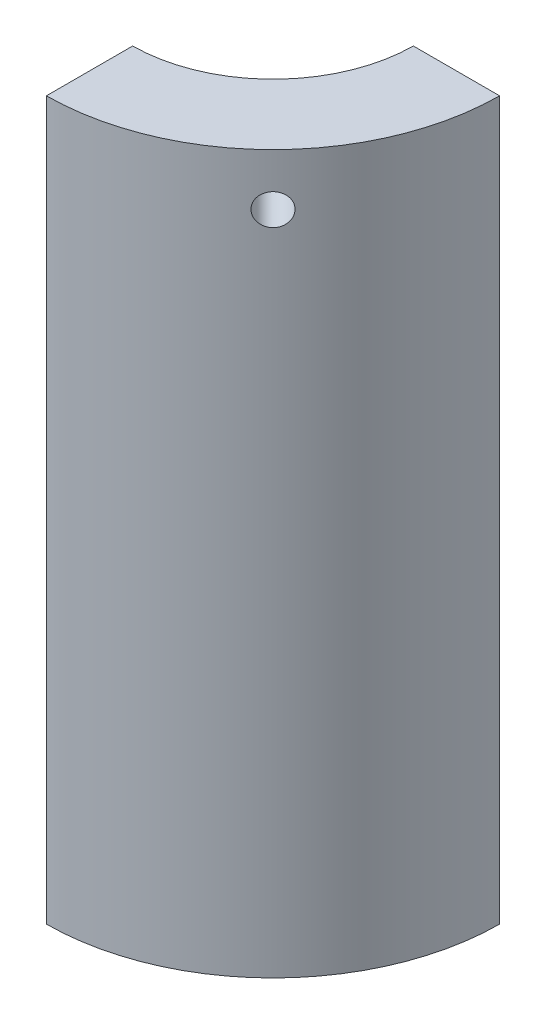
ISO-10303-21;
HEADER;
FILE_DESCRIPTION(('STEP AP214'),'2;1');
FILE_NAME('part.step','',(''),(''),'','','');
FILE_SCHEMA(('AUTOMOTIVE_DESIGN { 1 0 10303 214 1 1 1 1 }'));
ENDSEC;
DATA;
#1=APPLICATION_CONTEXT('core data for automotive mechanical design processes');
#2=APPLICATION_PROTOCOL_DEFINITION('international standard','automotive_design',2000,#1);
#3=PRODUCT_CONTEXT('',#1,'mechanical');
#4=PRODUCT('Part','Part','',(#3));
#5=PRODUCT_RELATED_PRODUCT_CATEGORY('part','',(#4));
#6=PRODUCT_DEFINITION_FORMATION('','',#4);
#7=PRODUCT_DEFINITION_CONTEXT('part definition',#1,'design');
#8=PRODUCT_DEFINITION('design','',#6,#7);
#9=PRODUCT_DEFINITION_SHAPE('','',#8);
#10=(LENGTH_UNIT() NAMED_UNIT(*) SI_UNIT(.MILLI.,.METRE.));
#11=(NAMED_UNIT(*) PLANE_ANGLE_UNIT() SI_UNIT($,.RADIAN.));
#12=(NAMED_UNIT(*) SI_UNIT($,.STERADIAN.) SOLID_ANGLE_UNIT());
#13=UNCERTAINTY_MEASURE_WITH_UNIT(LENGTH_MEASURE(1.E-05),#10,'distance_accuracy_value','');
#14=(GEOMETRIC_REPRESENTATION_CONTEXT(3) GLOBAL_UNCERTAINTY_ASSIGNED_CONTEXT((#13)) GLOBAL_UNIT_ASSIGNED_CONTEXT((#10,
#11,#12)) REPRESENTATION_CONTEXT('',''));
#15=CARTESIAN_POINT('',(0.,0.,0.));
#16=DIRECTION('',(0.,0.,1.));
#17=DIRECTION('',(1.,0.,0.));
#18=AXIS2_PLACEMENT_3D('',#15,#16,#17);
#19=CARTESIAN_POINT('',(-0.0819550041281925,-54.649002659367,-2.91275683956761));
#20=DIRECTION('',(0.,1.,0.));
#21=DIRECTION('',(0.,0.,1.));
#22=AXIS2_PLACEMENT_3D('',#19,#20,#21);
#23=CYLINDRICAL_SURFACE('',#22,13.6);
#24=CARTESIAN_POINT('',(10.5366861259922,9.35099734063299,5.58456394699311));
#25=CARTESIAN_POINT('',(10.5366843333004,9.43497761274647,5.58456726459027));
#26=CARTESIAN_POINT('',(10.5322416975841,9.51901224443722,5.5901271395209));
#27=CARTESIAN_POINT('',(10.5145412136004,9.68474823178205,5.61217483485136));
#28=CARTESIAN_POINT('',(10.5012738443178,9.76644696783289,5.6286744580967));
#29=CARTESIAN_POINT('',(10.4661794258843,9.92508726089925,5.67197564802975));
#30=CARTESIAN_POINT('',(10.4443578045023,10.002031798739,5.69877068195031));
#31=CARTESIAN_POINT('',(10.392576064214,10.1490433813716,5.76167978497555));
#32=CARTESIAN_POINT('',(10.3626174746914,10.2191117152156,5.79779210278655));
#33=CARTESIAN_POINT('',(10.2950123912164,10.3507052808136,5.87822207274482));
#34=CARTESIAN_POINT('',(10.2573362788045,10.4121960173808,5.92257127347902));
#35=CARTESIAN_POINT('',(10.1751412687481,10.5245914721989,6.01786055152042));
#36=CARTESIAN_POINT('',(10.1306220478704,10.57549569013,6.06880094014334));
#37=CARTESIAN_POINT('',(10.0355924836175,10.6653943476593,6.17571681931278));
#38=CARTESIAN_POINT('',(9.98506708938574,10.7043579533337,6.23170487030442));
#39=CARTESIAN_POINT('',(9.87931419716593,10.7690720126269,6.34679046523331));
#40=CARTESIAN_POINT('',(9.82408683683894,10.7948228529253,6.4058879181162));
#41=CARTESIAN_POINT('',(9.71057569617251,10.832278402526,6.52509700930848));
#42=CARTESIAN_POINT('',(9.65230533084169,10.844040091887,6.58520351510839));
#43=CARTESIAN_POINT('',(9.53409184404345,10.8533598847648,6.70486838188246));
#44=CARTESIAN_POINT('',(9.47414877466008,10.8509184300438,6.7644267598474));
#45=CARTESIAN_POINT('',(9.35458477909854,10.8319472637327,6.88105056391333));
#46=CARTESIAN_POINT('',(9.29496358507526,10.8154788259334,6.9381256994772));
#47=CARTESIAN_POINT('',(9.17757181317318,10.7690167546947,7.04855137888179));
#48=CARTESIAN_POINT('',(9.11980126374145,10.739022913457,7.10190186548411));
#49=CARTESIAN_POINT('',(9.00779257958304,10.6662950483306,7.20367699654527));
#50=CARTESIAN_POINT('',(8.95356219602528,10.6235341406904,7.25209095461346));
#51=CARTESIAN_POINT('',(8.85051723484523,10.5265055002948,7.34276156078564));
#52=CARTESIAN_POINT('',(8.80170285072048,10.4722373566218,7.38501798891631));
#53=CARTESIAN_POINT('',(8.71087537853335,10.3533906530275,7.46268200994373));
#54=CARTESIAN_POINT('',(8.66889987461099,10.2887587514455,7.49805195145781));
#55=CARTESIAN_POINT('',(8.5935291924902,10.1512034761403,7.56094313636126));
#56=CARTESIAN_POINT('',(8.56013403159186,10.0782800857,7.5884643639257));
#57=CARTESIAN_POINT('',(8.50312032388389,9.92616847012183,7.63512664072593));
#58=CARTESIAN_POINT('',(8.47950456496442,9.84697846616462,7.65426530036746));
#59=CARTESIAN_POINT('',(8.44294512554007,9.6846034389268,7.68378197455839));
#60=CARTESIAN_POINT('',(8.43000104766154,9.60141856452236,7.69416031530977));
#61=CARTESIAN_POINT('',(8.4153164908242,9.4338832280635,7.70592795811207));
#62=CARTESIAN_POINT('',(8.41351747977591,9.34954119102084,7.70736422270005));
#63=CARTESIAN_POINT('',(8.42103545825922,9.18167502130145,7.7013458296166));
#64=CARTESIAN_POINT('',(8.43035226438185,9.0981508751526,7.69389131864137));
#65=CARTESIAN_POINT('',(8.45970941438736,8.93451121403336,7.67026346877571));
#66=CARTESIAN_POINT('',(8.47972199048178,8.85438744997251,7.6541127058247));
#67=CARTESIAN_POINT('',(8.52971196218131,8.69956592431732,7.61341173686136));
#68=CARTESIAN_POINT('',(8.55968963354938,8.62486831295,7.58886129840519));
#69=CARTESIAN_POINT('',(8.62867525711629,8.48268043841175,7.531711907697));
#70=CARTESIAN_POINT('',(8.66772000483644,8.41522122620018,7.49908012330725));
#71=CARTESIAN_POINT('',(8.75340516338569,8.28974069515303,7.42646732334823));
#72=CARTESIAN_POINT('',(8.80004580334611,8.23171966112721,7.38648608607684));
#73=CARTESIAN_POINT('',(8.8995651689871,8.12650339694943,7.29981678492099));
#74=CARTESIAN_POINT('',(8.95247046165562,8.07935696714672,7.25309996063789));
#75=CARTESIAN_POINT('',(9.06260459794293,7.99756474628884,7.15414449907944));
#76=CARTESIAN_POINT('',(9.11983337131075,7.96291875217057,7.10190595151946));
#77=CARTESIAN_POINT('',(9.23665651831976,7.90719275689125,6.99329289863657));
#78=CARTESIAN_POINT('',(9.29624554604115,7.88608377294136,6.93692751931356));
#79=CARTESIAN_POINT('',(9.41606668452292,7.85793652569409,6.82143569023883));
#80=CARTESIAN_POINT('',(9.4762987729423,7.85089777516234,6.76230933616875));
#81=CARTESIAN_POINT('',(9.59531143744827,7.85109851001999,6.64326541228344));
#82=CARTESIAN_POINT('',(9.65409801926288,7.85826243752462,6.58335370485446));
#83=CARTESIAN_POINT('',(9.76892491519434,7.8865061180053,6.46418371799018));
#84=CARTESIAN_POINT('',(9.82496522854554,7.90758587486098,6.40492543873706));
#85=CARTESIAN_POINT('',(9.93284028003523,7.96304079234487,6.28888189733161));
#86=CARTESIAN_POINT('',(9.98467589055518,7.99741318646971,6.23209612332834));
#87=CARTESIAN_POINT('',(10.0829144178174,8.07846977512315,6.1227750928411));
#88=CARTESIAN_POINT('',(10.1293173287495,8.12515398281908,6.07023984090308));
#89=CARTESIAN_POINT('',(10.2158833303454,8.22979113387684,5.97087402479052));
#90=CARTESIAN_POINT('',(10.2560133636976,8.28780037740364,5.92407394633321));
#91=CARTESIAN_POINT('',(10.3289146730831,8.41332676999537,5.83807054114567));
#92=CARTESIAN_POINT('',(10.3616841907216,8.48084618474334,5.7988690299856));
#93=CARTESIAN_POINT('',(10.4192863047688,8.62370590974001,5.72934832322836));
#94=CARTESIAN_POINT('',(10.4440944890375,8.69906935426971,5.69905647091983));
#95=CARTESIAN_POINT('',(10.4851340319773,8.85526602136046,5.64865048620078));
#96=CARTESIAN_POINT('',(10.5013749325306,8.93609304509777,5.62852503194543));
#97=CARTESIAN_POINT('',(10.521001482927,9.07296884982259,5.6041357931914));
#98=CARTESIAN_POINT('',(10.5268775268496,9.12814676816543,5.59680908100987));
#99=CARTESIAN_POINT('',(10.53472043453,9.23920754345745,5.58702206677314));
#100=CARTESIAN_POINT('',(10.5366873194143,9.29509039659527,5.58456173841824));
#101=CARTESIAN_POINT('',(10.5366861259922,9.35099734063299,5.58456394699311));
#102=B_SPLINE_CURVE_WITH_KNOTS('',3,(#24,#25,#26,#27,#28,#29,#30,#31,#32,#33,#34,#35,#36,#37,
#38,#39,#40,#41,#42,#43,#44,#45,#46,#47,#48,#49,#50,#51,#52,#53,#54,#55,#56,#57,#58,#59,#60,#61,
#62,#63,#64,#65,#66,#67,#68,#69,#70,#71,#72,#73,#74,#75,#76,#77,#78,#79,#80,#81,#82,#83,#84,#85,
#86,#87,#88,#89,#90,#91,#92,#93,#94,#95,#96,#97,#98,#99,#100,#101),.UNSPECIFIED.,.T.,.F.,(4,2,2,
2,2,2,2,2,2,2,2,2,2,2,2,2,2,2,2,2,2,2,2,2,2,2,2,2,2,2,2,2,2,2,2,2,2,2,4),(0.,0.251736626328112,
0.503745293088847,0.755594315671462,1.00739603469475,1.26018286473901,1.51298163880034,
1.76642781214165,2.01986656780302,2.27226945236711,2.524664486451,2.77596260969474,
3.0272645939024,3.27909952497933,3.53094345047314,3.78412786268911,4.03731278538314,
4.29056983586601,4.54381745557365,4.79573392431704,5.04764623654199,5.2989077018795,
5.55017612092609,5.80248261578413,6.05479672291884,6.30822198084159,6.56164312181668,
6.81451985960879,7.06738784044762,7.31891417977464,7.57044058922551,7.82191467839664,
8.07338903651711,8.32614693606856,8.57896515429947,8.83255135127875,9.08585451504535,
9.25344032046004,9.42102522017737),.UNSPECIFIED.);
#103=CARTESIAN_POINT('',(10.5366861259922,9.35099734063299,5.58456394699311));
#104=VERTEX_POINT('',#103);
#105=EDGE_CURVE('E111',#104,#104,#102,.T.);
#106=ORIENTED_EDGE('',*,*,#105,.T.);
#107=EDGE_LOOP('',(#106));
#108=FACE_BOUND('',#107,.T.);
#109=CARTESIAN_POINT('',(-0.0819550041281925,14.350997340633,-2.91275683956761));
#110=DIRECTION('',(0.,1.,0.));
#111=DIRECTION('',(0.,0.,-1.));
#112=AXIS2_PLACEMENT_3D('',#109,#110,#111);
#113=CIRCLE('',#112,13.6);
#114=CARTESIAN_POINT('',(0.0180449958718076,14.350997340633,10.6868755084042));
#115=VERTEX_POINT('',#114);
#116=CARTESIAN_POINT('',(13.5176773438436,14.350997340633,-2.81275683956761));
#117=VERTEX_POINT('',#116);
#118=EDGE_CURVE('E108',#115,#117,#113,.T.);
#119=ORIENTED_EDGE('',*,*,#118,.T.);
#120=DIRECTION('',(0.,1.,0.));
#121=VECTOR('',#120,1.);
#122=CARTESIAN_POINT('',(13.5176773438436,-54.649002659367,-2.81275683956761));
#123=LINE('',#122,#121);
#124=CARTESIAN_POINT('',(13.5176773438436,-54.649002659367,-2.81275683956761));
#125=VERTEX_POINT('',#124);
#126=EDGE_CURVE('E11',#125,#117,#123,.T.);
#127=ORIENTED_EDGE('',*,*,#126,.F.);
#128=CARTESIAN_POINT('',(-0.0819550041281925,-54.649002659367,-2.91275683956761));
#129=DIRECTION('',(0.,1.,0.));
#130=DIRECTION('',(0.,0.,-1.));
#131=AXIS2_PLACEMENT_3D('',#128,#129,#130);
#132=CIRCLE('',#131,13.6);
#133=CARTESIAN_POINT('',(0.0180449958718076,-54.649002659367,10.6868755084042));
#134=VERTEX_POINT('',#133);
#135=EDGE_CURVE('E95',#134,#125,#132,.T.);
#136=ORIENTED_EDGE('',*,*,#135,.F.);
#137=DIRECTION('',(0.,1.,0.));
#138=VECTOR('',#137,1.);
#139=CARTESIAN_POINT('',(0.0180449958718076,-54.649002659367,10.6868755084042));
#140=LINE('',#139,#138);
#141=EDGE_CURVE('E104',#134,#115,#140,.T.);
#142=ORIENTED_EDGE('',*,*,#141,.T.);
#143=EDGE_LOOP('',(#119,#127,#136,#142));
#144=FACE_BOUND('',#143,.T.);
#145=ADVANCED_FACE('F37',(#108,#144),#23,.F.);
#146=CARTESIAN_POINT('',(13.5176773438436,-54.649002659367,-2.81275683956761));
#147=DIRECTION('',(0.,0.,1.));
#148=DIRECTION('',(1.,0.,0.));
#149=AXIS2_PLACEMENT_3D('',#146,#147,#148);
#150=PLANE('',#149);
#151=DIRECTION('',(1.,0.,0.));
#152=VECTOR('',#151,1.);
#153=CARTESIAN_POINT('',(13.5176773438436,14.350997340633,-2.81275683956761));
#154=LINE('',#153,#152);
#155=CARTESIAN_POINT('',(21.8138166424706,14.350997340633,-2.81275683956761));
#156=VERTEX_POINT('',#155);
#157=EDGE_CURVE('E99',#117,#156,#154,.T.);
#158=ORIENTED_EDGE('',*,*,#157,.T.);
#159=DIRECTION('',(0.,1.,0.));
#160=VECTOR('',#159,1.);
#161=CARTESIAN_POINT('',(21.8138166424706,-54.649002659367,-2.81275683956761));
#162=LINE('',#161,#160);
#163=CARTESIAN_POINT('',(21.8138166424706,-54.649002659367,-2.81275683956761));
#164=VERTEX_POINT('',#163);
#165=EDGE_CURVE('E52',#164,#156,#162,.T.);
#166=ORIENTED_EDGE('',*,*,#165,.F.);
#167=DIRECTION('',(1.,0.,0.));
#168=VECTOR('',#167,1.);
#169=CARTESIAN_POINT('',(13.5176773438436,-54.649002659367,-2.81275683956761));
#170=LINE('',#169,#168);
#171=EDGE_CURVE('E90',#125,#164,#170,.T.);
#172=ORIENTED_EDGE('',*,*,#171,.F.);
#173=ORIENTED_EDGE('',*,*,#126,.T.);
#174=EDGE_LOOP('',(#158,#166,#172,#173));
#175=FACE_BOUND('',#174,.T.);
#176=ADVANCED_FACE('F98',(#175),#150,.F.);
#177=CARTESIAN_POINT('',(-0.0819550041281925,-54.649002659367,-2.91275683956761));
#178=DIRECTION('',(0.,1.,0.));
#179=DIRECTION('',(0.,0.,1.));
#180=AXIS2_PLACEMENT_3D('',#177,#178,#179);
#181=CYLINDRICAL_SURFACE('',#180,21.896);
#182=CARTESIAN_POINT('',(16.4251419088551,9.35099734063299,11.473019729856));
#183=CARTESIAN_POINT('',(16.4251397806786,9.26684781378394,11.4730228288765));
#184=CARTESIAN_POINT('',(16.420465476132,9.18263978801122,11.4783912077651));
#185=CARTESIAN_POINT('',(16.4018576835635,9.01655015388137,11.4997005374179));
#186=CARTESIAN_POINT('',(16.3879134922448,8.93467134900874,11.5156537096689));
#187=CARTESIAN_POINT('',(16.3510837812481,8.77566995095656,11.5575861554805));
#188=CARTESIAN_POINT('',(16.328203071687,8.69854482490367,11.5835600352631));
#189=CARTESIAN_POINT('',(16.2740275699885,8.55120756534216,11.6446573870183));
#190=CARTESIAN_POINT('',(16.2427346713054,8.48099388102701,11.6797787999664));
#191=CARTESIAN_POINT('',(16.1724011565899,8.34932803584602,11.7580811539386));
#192=CARTESIAN_POINT('',(16.1333484407267,8.28788981896336,11.8012746754107));
#193=CARTESIAN_POINT('',(16.0484528117235,8.17563839636246,11.894292707042));
#194=CARTESIAN_POINT('',(16.0026096120677,8.12482563918992,11.9441174969899));
#195=CARTESIAN_POINT('',(15.9052120607174,8.03522359075146,12.0488746712333));
#196=CARTESIAN_POINT('',(15.8536522199236,7.99644599370461,12.1038119562553));
#197=CARTESIAN_POINT('',(15.746176469896,7.93208986628644,12.2170533830242));
#198=CARTESIAN_POINT('',(15.6902606149546,7.90651117143713,12.2753574828054));
#199=CARTESIAN_POINT('',(15.5756537148775,7.86931805479549,12.3934792345721));
#200=CARTESIAN_POINT('',(15.5169672066712,7.85768157433065,12.4532943423816));
#201=CARTESIAN_POINT('',(15.3983604972311,7.84863506387713,12.5727761717009));
#202=CARTESIAN_POINT('',(15.3384403122575,7.85122484650264,12.632442895155));
#203=CARTESIAN_POINT('',(15.2191843526898,7.87053919475609,12.7498400691009));
#204=CARTESIAN_POINT('',(15.1598477661606,7.88724003453165,12.8075736007044));
#205=CARTESIAN_POINT('',(15.0434052296993,7.9342655839413,12.9196412088716));
#206=CARTESIAN_POINT('',(14.9862992950697,7.96459038701955,12.9739752621159));
#207=CARTESIAN_POINT('',(14.876000072498,8.03802981007584,13.0778700229803));
#208=CARTESIAN_POINT('',(14.8228101106286,8.08115514941866,13.1274266836769));
#209=CARTESIAN_POINT('',(14.7220457588207,8.17896368203495,13.2204724811378));
#210=CARTESIAN_POINT('',(14.6744714452405,8.23364703243901,13.2639615353999));
#211=CARTESIAN_POINT('',(14.5863577494869,8.35315325444807,13.3439024523992));
#212=CARTESIAN_POINT('',(14.5458330201181,8.41799672513851,13.3803396749297));
#213=CARTESIAN_POINT('',(14.473258414433,8.55591045071548,13.4452062121421));
#214=CARTESIAN_POINT('',(14.4412085422678,8.62898070963161,13.4736355229016));
#215=CARTESIAN_POINT('',(14.3866474436611,8.78128733904095,13.521831413103));
#216=CARTESIAN_POINT('',(14.364136902652,8.86052415213738,13.541597370058));
#217=CARTESIAN_POINT('',(14.3294206402143,9.02290837920561,13.5720120500422));
#218=CARTESIAN_POINT('',(14.3172147729782,9.10605573782699,13.5826609020753));
#219=CARTESIAN_POINT('',(14.3035399390968,9.27371998173045,13.5945880445361));
#220=CARTESIAN_POINT('',(14.302049211512,9.35823374178251,13.5958853267006));
#221=CARTESIAN_POINT('',(14.3097982424176,9.52639068482845,13.5891303217794));
#222=CARTESIAN_POINT('',(14.3190379336518,9.6100338732756,13.5810780932946));
#223=CARTESIAN_POINT('',(14.3479172629951,9.7739935420513,13.5558182660483));
#224=CARTESIAN_POINT('',(14.3675468850611,9.85431314609963,13.5386194846198));
#225=CARTESIAN_POINT('',(14.4165363508843,10.0094421739133,13.4954613429126));
#226=CARTESIAN_POINT('',(14.4458963006087,10.0842515376592,13.4695018872265));
#227=CARTESIAN_POINT('',(14.5134249679297,10.2263687600732,13.4093673811682));
#228=CARTESIAN_POINT('',(14.551607792544,10.2936643465115,13.3751791700399));
#229=CARTESIAN_POINT('',(14.6355085243322,10.4187200083545,13.2994074224649));
#230=CARTESIAN_POINT('',(14.6812265196898,10.4764799721482,13.2578237994695));
#231=CARTESIAN_POINT('',(14.7788174323099,10.58092239809,13.1681836598594));
#232=CARTESIAN_POINT('',(14.8307005042154,10.6275861932896,13.120116445869));
#233=CARTESIAN_POINT('',(14.9389317762567,10.7083838452164,13.0187611573495));
#234=CARTESIAN_POINT('',(14.9952799443682,10.7425177917996,12.9654731202644));
#235=CARTESIAN_POINT('',(15.1106634358481,10.7972544444943,12.8551067960883));
#236=CARTESIAN_POINT('',(15.1696963792792,10.8178688943478,12.798031846099));
#237=CARTESIAN_POINT('',(15.2887326939174,10.8450198048976,12.6815916439413));
#238=CARTESIAN_POINT('',(15.3487360532866,10.851556437195,12.6222264196992));
#239=CARTESIAN_POINT('',(15.4678525539784,10.850364423108,12.5029944572585));
#240=CARTESIAN_POINT('',(15.5269672664743,10.8426649575085,12.4431289947856));
#241=CARTESIAN_POINT('',(15.6427847876851,10.813279901871,12.3245082876692));
#242=CARTESIAN_POINT('',(15.6994875923688,10.7915942884591,12.2657530448814));
#243=CARTESIAN_POINT('',(15.8089604754583,10.7348593399247,12.1511041800668));
#244=CARTESIAN_POINT('',(15.8617306235727,10.6998102417451,12.0952105073226));
#245=CARTESIAN_POINT('',(15.9619813472762,10.6173470271446,11.9879920033945));
#246=CARTESIAN_POINT('',(16.0094620460564,10.5699331987838,11.9366670658106));
#247=CARTESIAN_POINT('',(16.0980479458658,10.4639778330428,11.8400947625119));
#248=CARTESIAN_POINT('',(16.1391406717811,10.405415006572,11.7948593115121));
#249=CARTESIAN_POINT('',(16.2138644978491,10.2788563377225,11.7120236267325));
#250=CARTESIAN_POINT('',(16.2474937746225,10.2108581968023,11.6744252589419));
#251=CARTESIAN_POINT('',(16.3065332881232,10.0672675747942,11.6080643915972));
#252=CARTESIAN_POINT('',(16.3319319371672,9.99166458144597,11.5793143522068));
#253=CARTESIAN_POINT('',(16.373839171985,9.83514081756835,11.5317116248798));
#254=CARTESIAN_POINT('',(16.3903581209246,9.75422637019074,11.5128474002272));
#255=CARTESIAN_POINT('',(16.4098679751428,9.61918400271093,11.4905315084499));
#256=CARTESIAN_POINT('',(16.415589582763,9.56592793049555,11.4839744867231));
#257=CARTESIAN_POINT('',(16.4232272280398,9.45878835411173,11.4752176085078));
#258=CARTESIAN_POINT('',(16.4251432721984,9.40490485101544,11.4730177445748));
#259=CARTESIAN_POINT('',(16.4251419088551,9.35099734063299,11.473019729856));
#260=B_SPLINE_CURVE_WITH_KNOTS('',3,(#182,#183,#184,#185,#186,#187,#188,#189,#190,#191,#192,
#193,#194,#195,#196,#197,#198,#199,#200,#201,#202,#203,#204,#205,#206,#207,#208,#209,#210,#211,
#212,#213,#214,#215,#216,#217,#218,#219,#220,#221,#222,#223,#224,#225,#226,#227,#228,#229,#230,
#231,#232,#233,#234,#235,#236,#237,#238,#239,#240,#241,#242,#243,#244,#245,#246,#247,#248,#249,
#250,#251,#252,#253,#254,#255,#256,#257,#258,#259),.UNSPECIFIED.,.T.,.F.,(4,2,2,2,2,2,2,2,2,2,2,
2,2,2,2,2,2,2,2,2,2,2,2,2,2,2,2,2,2,2,2,2,2,2,2,2,2,2,4),(0.,0.252251776916716,
0.504795318550703,0.757203114523012,1.00955414488159,1.26230179681759,1.51506011615023,
1.76806327008039,2.02106327113794,2.27366245746243,2.52625831660328,2.778430312847,
3.03060403871661,3.2829895373801,3.53537846743249,3.78828588614461,4.04119342873443,
4.29411914048497,4.54704127336582,4.79944961150958,5.05185636761275,5.30402024194875,
5.55618686253803,5.80875950047915,6.06133509447868,6.31433263390772,6.56732835896505,
6.82010402658928,7.07287661299573,7.32513164699719,7.57738710257047,7.82963808570551,
8.08188319269667,8.334614884385,8.58740825260763,8.84055599113302,9.09340764541689,
9.25500437715959,9.41660083280599),.UNSPECIFIED.);
#261=CARTESIAN_POINT('',(16.4251419088551,9.35099734063299,11.473019729856));
#262=VERTEX_POINT('',#261);
#263=EDGE_CURVE('E41',#262,#262,#260,.T.);
#264=ORIENTED_EDGE('',*,*,#263,.T.);
#265=EDGE_LOOP('',(#264));
#266=FACE_BOUND('',#265,.T.);
#267=CARTESIAN_POINT('',(-0.0819550041281925,14.350997340633,-2.91275683956761));
#268=DIRECTION('',(0.,-1.,0.));
#269=DIRECTION('',(0.,0.,-1.));
#270=AXIS2_PLACEMENT_3D('',#267,#268,#269);
#271=CIRCLE('',#270,21.896);
#272=CARTESIAN_POINT('',(0.0180449958718094,14.350997340633,18.9830148070312));
#273=VERTEX_POINT('',#272);
#274=EDGE_CURVE('E77',#156,#273,#271,.T.);
#275=ORIENTED_EDGE('',*,*,#274,.T.);
#276=DIRECTION('',(0.,1.,0.));
#277=VECTOR('',#276,1.);
#278=CARTESIAN_POINT('',(0.0180449958718094,-54.649002659367,18.9830148070312));
#279=LINE('',#278,#277);
#280=CARTESIAN_POINT('',(0.0180449958718094,-54.649002659367,18.9830148070312));
#281=VERTEX_POINT('',#280);
#282=EDGE_CURVE('E100',#281,#273,#279,.T.);
#283=ORIENTED_EDGE('',*,*,#282,.F.);
#284=CARTESIAN_POINT('',(-0.0819550041281925,-54.649002659367,-2.91275683956761));
#285=DIRECTION('',(0.,-1.,0.));
#286=DIRECTION('',(0.,0.,-1.));
#287=AXIS2_PLACEMENT_3D('',#284,#285,#286);
#288=CIRCLE('',#287,21.896);
#289=EDGE_CURVE('E93',#164,#281,#288,.T.);
#290=ORIENTED_EDGE('',*,*,#289,.F.);
#291=ORIENTED_EDGE('',*,*,#165,.T.);
#292=EDGE_LOOP('',(#275,#283,#290,#291));
#293=FACE_BOUND('',#292,.T.);
#294=ADVANCED_FACE('F102',(#266,#293),#181,.T.);
#295=CARTESIAN_POINT('',(0.0180449958718076,-54.649002659367,18.9830148070312));
#296=DIRECTION('',(1.,0.,0.));
#297=DIRECTION('',(0.,0.,-1.));
#298=AXIS2_PLACEMENT_3D('',#295,#296,#297);
#299=PLANE('',#298);
#300=DIRECTION('',(0.,0.,-1.));
#301=VECTOR('',#300,1.);
#302=CARTESIAN_POINT('',(0.0180449958718076,14.350997340633,18.9830148070312));
#303=LINE('',#302,#301);
#304=EDGE_CURVE('E83',#273,#115,#303,.T.);
#305=ORIENTED_EDGE('',*,*,#304,.T.);
#306=ORIENTED_EDGE('',*,*,#141,.F.);
#307=DIRECTION('',(0.,0.,-1.));
#308=VECTOR('',#307,1.);
#309=CARTESIAN_POINT('',(0.0180449958718076,-54.649002659367,18.9830148070312));
#310=LINE('',#309,#308);
#311=EDGE_CURVE('E60',#281,#134,#310,.T.);
#312=ORIENTED_EDGE('',*,*,#311,.F.);
#313=ORIENTED_EDGE('',*,*,#282,.T.);
#314=EDGE_LOOP('',(#305,#306,#312,#313));
#315=FACE_BOUND('',#314,.T.);
#316=ADVANCED_FACE('F116',(#315),#299,.F.);
#317=CARTESIAN_POINT('',(-0.0819550041281925,-54.649002659367,-2.91275683956761));
#318=DIRECTION('',(0.,-1.,0.));
#319=DIRECTION('',(0.,0.,-1.));
#320=AXIS2_PLACEMENT_3D('',#317,#318,#319);
#321=PLANE('',#320);
#322=ORIENTED_EDGE('',*,*,#135,.T.);
#323=ORIENTED_EDGE('',*,*,#171,.T.);
#324=ORIENTED_EDGE('',*,*,#289,.T.);
#325=ORIENTED_EDGE('',*,*,#311,.T.);
#326=EDGE_LOOP('',(#322,#323,#324,#325));
#327=FACE_BOUND('',#326,.T.);
#328=ADVANCED_FACE('F91',(#327),#321,.T.);
#329=CARTESIAN_POINT('',(-0.0819550041281925,14.350997340633,-2.91275683956761));
#330=DIRECTION('',(0.,-1.,0.));
#331=DIRECTION('',(0.,0.,-1.));
#332=AXIS2_PLACEMENT_3D('',#329,#330,#331);
#333=PLANE('',#332);
#334=ORIENTED_EDGE('',*,*,#118,.F.);
#335=ORIENTED_EDGE('',*,*,#304,.F.);
#336=ORIENTED_EDGE('',*,*,#274,.F.);
#337=ORIENTED_EDGE('',*,*,#157,.F.);
#338=EDGE_LOOP('',(#334,#335,#336,#337));
#339=FACE_BOUND('',#338,.T.);
#340=ADVANCED_FACE('F119',(#339),#333,.F.);
#341=CARTESIAN_POINT('',(-25.0779550041282,9.35099734063299,-27.9087568395676));
#342=DIRECTION('',(0.707106781186548,0.,0.707106781186547));
#343=DIRECTION('',(0.707106781186547,0.,-0.707106781186548));
#344=AXIS2_PLACEMENT_3D('',#341,#342,#343);
#345=CYLINDRICAL_SURFACE('',#344,1.49999999999999);
#346=ORIENTED_EDGE('',*,*,#263,.F.);
#347=EDGE_LOOP('',(#346));
#348=FACE_BOUND('',#347,.T.);
#349=ORIENTED_EDGE('',*,*,#105,.F.);
#350=EDGE_LOOP('',(#349));
#351=FACE_BOUND('',#350,.T.);
#352=ADVANCED_FACE('F126',(#348,#351),#345,.F.);
#353=CLOSED_SHELL('',(#145,#176,#294,#316,#328,#340,#352));
#354=MANIFOLD_SOLID_BREP('B2',#353);
#355=ADVANCED_BREP_SHAPE_REPRESENTATION('',(#18,#354),#14);
#356=SHAPE_DEFINITION_REPRESENTATION(#9,#355);
ENDSEC;
END-ISO-10303-21;
